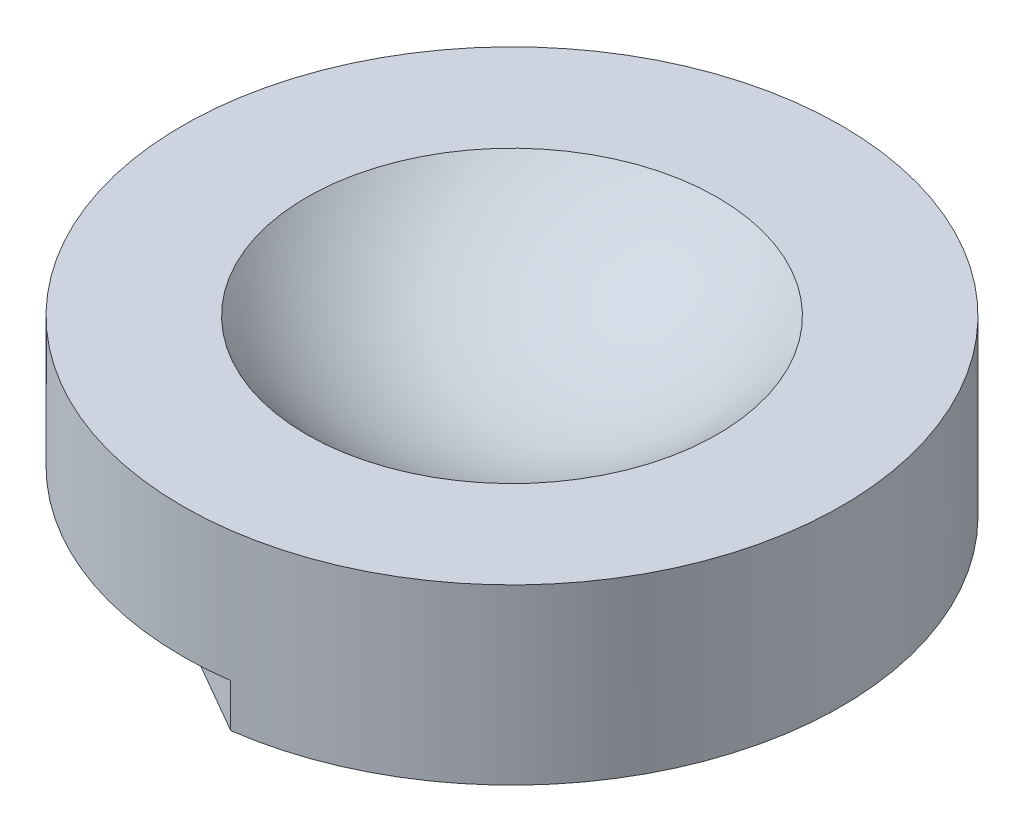
ISO-10303-21;
HEADER;
FILE_DESCRIPTION(('STEP AP214'),'2;1');
FILE_NAME('part.step','',(''),(''),'','','');
FILE_SCHEMA(('AUTOMOTIVE_DESIGN { 1 0 10303 214 1 1 1 1 }'));
ENDSEC;
DATA;
#1=APPLICATION_CONTEXT('core data for automotive mechanical design processes');
#2=APPLICATION_PROTOCOL_DEFINITION('international standard','automotive_design',2000,#1);
#3=PRODUCT_CONTEXT('',#1,'mechanical');
#4=PRODUCT('Part','Part','',(#3));
#5=PRODUCT_RELATED_PRODUCT_CATEGORY('part','',(#4));
#6=PRODUCT_DEFINITION_FORMATION('','',#4);
#7=PRODUCT_DEFINITION_CONTEXT('part definition',#1,'design');
#8=PRODUCT_DEFINITION('design','',#6,#7);
#9=PRODUCT_DEFINITION_SHAPE('','',#8);
#10=(LENGTH_UNIT() NAMED_UNIT(*) SI_UNIT(.MILLI.,.METRE.));
#11=(NAMED_UNIT(*) PLANE_ANGLE_UNIT() SI_UNIT($,.RADIAN.));
#12=(NAMED_UNIT(*) SI_UNIT($,.STERADIAN.) SOLID_ANGLE_UNIT());
#13=UNCERTAINTY_MEASURE_WITH_UNIT(LENGTH_MEASURE(1.E-05),#10,'distance_accuracy_value','');
#14=(GEOMETRIC_REPRESENTATION_CONTEXT(3) GLOBAL_UNCERTAINTY_ASSIGNED_CONTEXT((#13)) GLOBAL_UNIT_ASSIGNED_CONTEXT((#10,
#11,#12)) REPRESENTATION_CONTEXT('',''));
#15=CARTESIAN_POINT('',(0.,0.,0.));
#16=DIRECTION('',(0.,0.,1.));
#17=DIRECTION('',(1.,0.,0.));
#18=AXIS2_PLACEMENT_3D('',#15,#16,#17);
#19=CARTESIAN_POINT('',(-71.2916512459885,69.5,25.9807621135332));
#20=DIRECTION('',(0.,-1.,0.));
#21=DIRECTION('',(0.,0.,1.));
#22=AXIS2_PLACEMENT_3D('',#19,#20,#21);
#23=CYLINDRICAL_SURFACE('',#22,3.80000000000001);
#24=CARTESIAN_POINT('',(-71.2916512459885,69.,25.9807621135332));
#25=DIRECTION('',(0.,-1.,0.));
#26=DIRECTION('',(0.,0.,-1.));
#27=AXIS2_PLACEMENT_3D('',#24,#25,#26);
#28=CIRCLE('',#27,3.80000000000001);
#29=CARTESIAN_POINT('',(-74.8115522336609,69.,27.4126479459174));
#30=VERTEX_POINT('',#29);
#31=CARTESIAN_POINT('',(-70.7717502583161,69.,29.7450287038555));
#32=VERTEX_POINT('',#31);
#33=EDGE_CURVE('E80',#30,#32,#28,.T.);
#34=ORIENTED_EDGE('',*,*,#33,.F.);
#35=DIRECTION('',(0.,-1.,0.));
#36=VECTOR('',#35,1.);
#37=CARTESIAN_POINT('',(-74.8115522336609,69.5,27.4126479459174));
#38=LINE('',#37,#36);
#39=CARTESIAN_POINT('',(-74.8115522336609,69.5,27.4126479459174));
#40=VERTEX_POINT('',#39);
#41=EDGE_CURVE('E49',#40,#30,#38,.T.);
#42=ORIENTED_EDGE('',*,*,#41,.F.);
#43=CARTESIAN_POINT('',(-71.2916512459885,69.5,25.9807621135332));
#44=DIRECTION('',(0.,-1.,0.));
#45=DIRECTION('',(0.,0.,-1.));
#46=AXIS2_PLACEMENT_3D('',#43,#44,#45);
#47=CIRCLE('',#46,3.8);
#48=CARTESIAN_POINT('',(-70.7717502583161,69.5,29.7450287038555));
#49=VERTEX_POINT('',#48);
#50=EDGE_CURVE('E72',#49,#40,#47,.T.);
#51=ORIENTED_EDGE('',*,*,#50,.F.);
#52=DIRECTION('',(0.,-1.,0.));
#53=VECTOR('',#52,1.);
#54=CARTESIAN_POINT('',(-70.7717502583161,69.5,29.7450287038555));
#55=LINE('',#54,#53);
#56=EDGE_CURVE('E11',#49,#32,#55,.T.);
#57=ORIENTED_EDGE('',*,*,#56,.T.);
#58=EDGE_LOOP('',(#34,#42,#51,#57));
#59=FACE_BOUND('',#58,.T.);
#60=CARTESIAN_POINT('',(-71.2916512459885,71.,25.9807621135332));
#61=DIRECTION('',(0.,-1.,0.));
#62=DIRECTION('',(0.,0.,-1.));
#63=AXIS2_PLACEMENT_3D('',#60,#61,#62);
#64=CIRCLE('',#63,3.8);
#65=CARTESIAN_POINT('',(-71.2916512459885,71.,22.1807621135332));
#66=VERTEX_POINT('',#65);
#67=EDGE_CURVE('E74',#66,#66,#64,.T.);
#68=ORIENTED_EDGE('',*,*,#67,.T.);
#69=EDGE_LOOP('',(#68));
#70=FACE_BOUND('',#69,.T.);
#71=ADVANCED_FACE('F41',(#59,#70),#23,.T.);
#72=CARTESIAN_POINT('',(-70.7717502583161,69.5,29.7450287038555));
#73=DIRECTION('',(0.499999999999999,0.,-0.866025403784439));
#74=DIRECTION('',(-0.866025403784439,0.,-0.499999999999999));
#75=AXIS2_PLACEMENT_3D('',#72,#73,#74);
#76=PLANE('',#75);
#77=DIRECTION('',(-0.866025403784439,0.,-0.499999999999999));
#78=VECTOR('',#77,1.);
#79=CARTESIAN_POINT('',(-70.7717502583161,69.,29.7450287038555));
#80=LINE('',#79,#78);
#81=EDGE_CURVE('E63',#32,#30,#80,.T.);
#82=ORIENTED_EDGE('',*,*,#81,.F.);
#83=ORIENTED_EDGE('',*,*,#56,.F.);
#84=DIRECTION('',(-0.866025403784439,0.,-0.499999999999999));
#85=VECTOR('',#84,1.);
#86=CARTESIAN_POINT('',(-70.7717502583161,69.5,29.7450287038555));
#87=LINE('',#86,#85);
#88=EDGE_CURVE('E57',#49,#40,#87,.T.);
#89=ORIENTED_EDGE('',*,*,#88,.T.);
#90=ORIENTED_EDGE('',*,*,#41,.T.);
#91=EDGE_LOOP('',(#82,#83,#89,#90));
#92=FACE_BOUND('',#91,.T.);
#93=ADVANCED_FACE('F66',(#92),#76,.F.);
#94=CARTESIAN_POINT('',(-71.2916512459885,69.,25.9807621135332));
#95=DIRECTION('',(0.,1.,0.));
#96=DIRECTION('',(0.,0.,-1.));
#97=AXIS2_PLACEMENT_3D('',#94,#95,#96);
#98=PLANE('',#97);
#99=ORIENTED_EDGE('',*,*,#33,.T.);
#100=ORIENTED_EDGE('',*,*,#81,.T.);
#101=EDGE_LOOP('',(#99,#100));
#102=FACE_BOUND('',#101,.T.);
#103=ADVANCED_FACE('F100',(#102),#98,.F.);
#104=CARTESIAN_POINT('',(-71.2916512459885,69.5,25.9807621135332));
#105=DIRECTION('',(0.,1.,0.));
#106=DIRECTION('',(0.,0.,-1.));
#107=AXIS2_PLACEMENT_3D('',#104,#105,#106);
#108=PLANE('',#107);
#109=ORIENTED_EDGE('',*,*,#50,.T.);
#110=ORIENTED_EDGE('',*,*,#88,.F.);
#111=EDGE_LOOP('',(#109,#110));
#112=FACE_BOUND('',#111,.T.);
#113=ADVANCED_FACE('F75',(#112),#108,.F.);
#114=CARTESIAN_POINT('',(-71.2916512459885,71.,25.9807621135332));
#115=DIRECTION('',(0.,1.,0.));
#116=DIRECTION('',(0.,0.,-1.));
#117=AXIS2_PLACEMENT_3D('',#114,#115,#116);
#118=PLANE('',#117);
#119=CARTESIAN_POINT('',(-71.2916512459885,71.,25.9807621135332));
#120=DIRECTION('',(0.,-1.,0.));
#121=DIRECTION('',(0.,0.,-1.));
#122=AXIS2_PLACEMENT_3D('',#119,#120,#121);
#123=CIRCLE('',#122,2.36854385646542);
#124=CARTESIAN_POINT('',(-71.2916512459885,71.,23.6122182570677));
#125=VERTEX_POINT('',#124);
#126=EDGE_CURVE('E42',#125,#125,#123,.T.);
#127=ORIENTED_EDGE('',*,*,#126,.T.);
#128=EDGE_LOOP('',(#127));
#129=FACE_BOUND('',#128,.T.);
#130=ORIENTED_EDGE('',*,*,#67,.F.);
#131=EDGE_LOOP('',(#130));
#132=FACE_BOUND('',#131,.T.);
#133=ADVANCED_FACE('F88',(#129,#132),#118,.T.);
#134=CARTESIAN_POINT('',(-71.2916512459885,73.,25.9807621135332));
#135=DIRECTION('',(0.,0.,-1.));
#136=DIRECTION('',(-1.,0.,0.));
#137=AXIS2_PLACEMENT_3D('',#134,#135,#136);
#138=SPHERICAL_SURFACE('',#137,3.1);
#139=CARTESIAN_POINT('',(-71.2916512459885,73.,25.9807621135332));
#140=DIRECTION('',(0.,-1.,0.));
#141=DIRECTION('',(0.,0.,-1.));
#142=AXIS2_PLACEMENT_3D('',#139,#140,#141);
#143=SPHERICAL_SURFACE('',#142,3.1);
#144=ORIENTED_EDGE('',*,*,#126,.F.);
#145=EDGE_LOOP('',(#144));
#146=FACE_BOUND('',#145,.T.);
#147=ADVANCED_FACE('F86',(#146),#143,.F.);
#148=CLOSED_SHELL('',(#71,#93,#103,#113,#133,#147));
#149=MANIFOLD_SOLID_BREP('B2',#148);
#150=ADVANCED_BREP_SHAPE_REPRESENTATION('',(#18,#149),#14);
#151=SHAPE_DEFINITION_REPRESENTATION(#9,#150);
ENDSEC;
END-ISO-10303-21;
